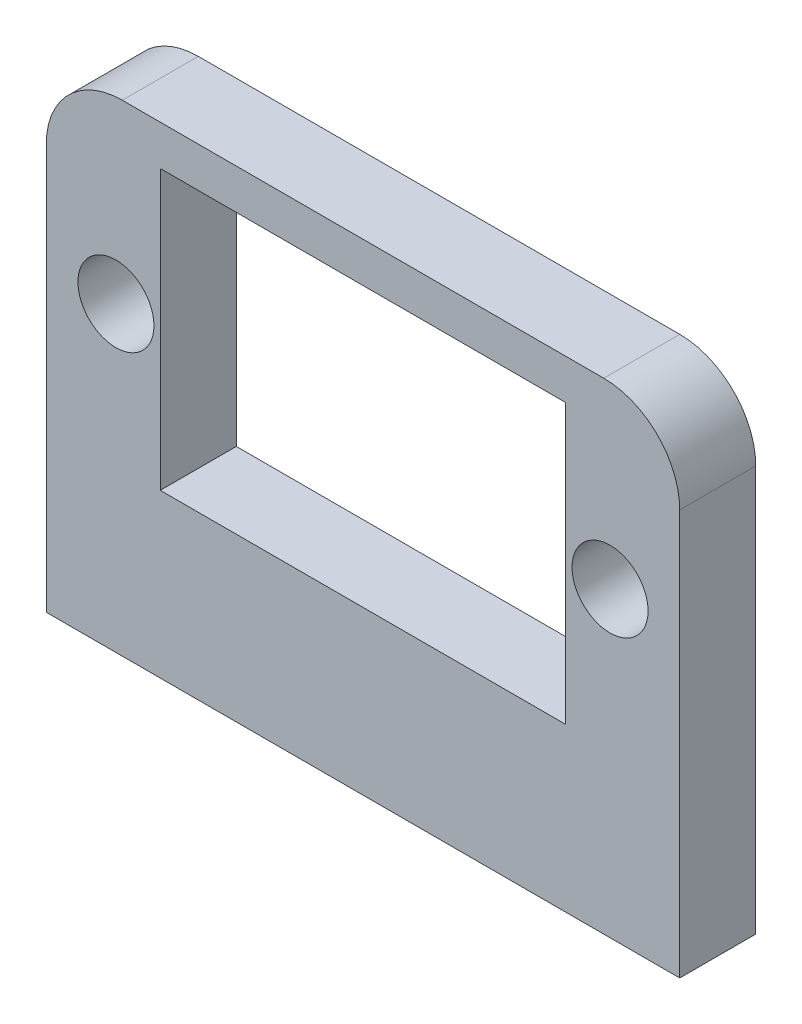
ISO-10303-21;
HEADER;
FILE_DESCRIPTION(('STEP AP214'),'2;1');
FILE_NAME('part.step','',(''),(''),'','','');
FILE_SCHEMA(('AUTOMOTIVE_DESIGN { 1 0 10303 214 1 1 1 1 }'));
ENDSEC;
DATA;
#1=APPLICATION_CONTEXT('core data for automotive mechanical design processes');
#2=APPLICATION_PROTOCOL_DEFINITION('international standard','automotive_design',2000,#1);
#3=PRODUCT_CONTEXT('',#1,'mechanical');
#4=PRODUCT('Part','Part','',(#3));
#5=PRODUCT_RELATED_PRODUCT_CATEGORY('part','',(#4));
#6=PRODUCT_DEFINITION_FORMATION('','',#4);
#7=PRODUCT_DEFINITION_CONTEXT('part definition',#1,'design');
#8=PRODUCT_DEFINITION('design','',#6,#7);
#9=PRODUCT_DEFINITION_SHAPE('','',#8);
#10=(LENGTH_UNIT() NAMED_UNIT(*) SI_UNIT(.MILLI.,.METRE.));
#11=(NAMED_UNIT(*) PLANE_ANGLE_UNIT() SI_UNIT($,.RADIAN.));
#12=(NAMED_UNIT(*) SI_UNIT($,.STERADIAN.) SOLID_ANGLE_UNIT());
#13=UNCERTAINTY_MEASURE_WITH_UNIT(LENGTH_MEASURE(1.E-05),#10,'distance_accuracy_value','');
#14=(GEOMETRIC_REPRESENTATION_CONTEXT(3) GLOBAL_UNCERTAINTY_ASSIGNED_CONTEXT((#13)) GLOBAL_UNIT_ASSIGNED_CONTEXT((#10,
#11,#12)) REPRESENTATION_CONTEXT('',''));
#15=CARTESIAN_POINT('',(0.,0.,0.));
#16=DIRECTION('',(0.,0.,1.));
#17=DIRECTION('',(1.,0.,0.));
#18=AXIS2_PLACEMENT_3D('',#15,#16,#17);
#19=CARTESIAN_POINT('',(-9.49999999999999,15.,0.));
#20=DIRECTION('',(0.,0.,-1.));
#21=DIRECTION('',(-1.,0.,0.));
#22=AXIS2_PLACEMENT_3D('',#19,#20,#21);
#23=CYLINDRICAL_SURFACE('',#22,3.);
#24=CARTESIAN_POINT('',(-9.5,15.,-13.1108616705018));
#25=DIRECTION('',(0.,0.,1.));
#26=DIRECTION('',(1.,0.,0.));
#27=AXIS2_PLACEMENT_3D('',#24,#25,#26);
#28=CIRCLE('',#27,3.);
#29=CARTESIAN_POINT('',(-12.5,15.,-13.1108616705018));
#30=VERTEX_POINT('',#29);
#31=CARTESIAN_POINT('',(-9.5,18.,-13.1108616705018));
#32=VERTEX_POINT('',#31);
#33=EDGE_CURVE('E197',#30,#32,#28,.F.);
#34=ORIENTED_EDGE('',*,*,#33,.F.);
#35=DIRECTION('',(0.,0.,1.));
#36=VECTOR('',#35,1.);
#37=CARTESIAN_POINT('',(-12.5,15.,-13.1108616705018));
#38=LINE('',#37,#36);
#39=CARTESIAN_POINT('',(-12.5,15.,-10.1108616705018));
#40=VERTEX_POINT('',#39);
#41=EDGE_CURVE('E195',#40,#30,#38,.F.);
#42=ORIENTED_EDGE('',*,*,#41,.F.);
#43=CARTESIAN_POINT('',(-9.5,15.,-10.1108616705018));
#44=DIRECTION('',(0.,0.,-1.));
#45=DIRECTION('',(-1.,0.,0.));
#46=AXIS2_PLACEMENT_3D('',#43,#44,#45);
#47=CIRCLE('',#46,3.);
#48=CARTESIAN_POINT('',(-9.5,18.,-10.1108616705018));
#49=VERTEX_POINT('',#48);
#50=EDGE_CURVE('E193',#49,#40,#47,.F.);
#51=ORIENTED_EDGE('',*,*,#50,.F.);
#52=DIRECTION('',(0.,0.,1.));
#53=VECTOR('',#52,1.);
#54=CARTESIAN_POINT('',(-9.5,18.,-10.1108616705018));
#55=LINE('',#54,#53);
#56=EDGE_CURVE('E123',#32,#49,#55,.T.);
#57=ORIENTED_EDGE('',*,*,#56,.F.);
#58=EDGE_LOOP('',(#34,#42,#51,#57));
#59=FACE_BOUND('',#58,.T.);
#60=ADVANCED_FACE('F38',(#59),#23,.T.);
#61=CARTESIAN_POINT('',(0.,18.,0.));
#62=DIRECTION('',(0.,1.,0.));
#63=DIRECTION('',(0.,0.,1.));
#64=AXIS2_PLACEMENT_3D('',#61,#62,#63);
#65=PLANE('',#64);
#66=DIRECTION('',(1.,0.,0.));
#67=VECTOR('',#66,1.);
#68=CARTESIAN_POINT('',(-12.5,18.,-10.1108616705018));
#69=LINE('',#68,#67);
#70=CARTESIAN_POINT('',(9.5,18.,-10.1108616705018));
#71=VERTEX_POINT('',#70);
#72=EDGE_CURVE('E185',#49,#71,#69,.T.);
#73=ORIENTED_EDGE('',*,*,#72,.T.);
#74=DIRECTION('',(0.,0.,-1.));
#75=VECTOR('',#74,1.);
#76=CARTESIAN_POINT('',(9.5,18.,-13.1108616705018));
#77=LINE('',#76,#75);
#78=CARTESIAN_POINT('',(9.5,18.,-13.1108616705018));
#79=VERTEX_POINT('',#78);
#80=EDGE_CURVE('E200',#71,#79,#77,.T.);
#81=ORIENTED_EDGE('',*,*,#80,.T.);
#82=DIRECTION('',(-1.,0.,0.));
#83=VECTOR('',#82,1.);
#84=CARTESIAN_POINT('',(-12.5,18.,-13.1108616705018));
#85=LINE('',#84,#83);
#86=EDGE_CURVE('E183',#79,#32,#85,.T.);
#87=ORIENTED_EDGE('',*,*,#86,.T.);
#88=ORIENTED_EDGE('',*,*,#56,.T.);
#89=EDGE_LOOP('',(#73,#81,#87,#88));
#90=FACE_BOUND('',#89,.T.);
#91=ADVANCED_FACE('F205',(#90),#65,.T.);
#92=CARTESIAN_POINT('',(9.50000000000002,15.,0.));
#93=DIRECTION('',(0.,0.,1.));
#94=DIRECTION('',(1.,0.,0.));
#95=AXIS2_PLACEMENT_3D('',#92,#93,#94);
#96=CYLINDRICAL_SURFACE('',#95,3.);
#97=CARTESIAN_POINT('',(9.5,15.,-10.1108616705018));
#98=DIRECTION('',(0.,0.,-1.));
#99=DIRECTION('',(-1.,0.,0.));
#100=AXIS2_PLACEMENT_3D('',#97,#98,#99);
#101=CIRCLE('',#100,3.);
#102=CARTESIAN_POINT('',(12.5,15.,-10.1108616705018));
#103=VERTEX_POINT('',#102);
#104=EDGE_CURVE('E11',#103,#71,#101,.F.);
#105=ORIENTED_EDGE('',*,*,#104,.F.);
#106=DIRECTION('',(0.,0.,-1.));
#107=VECTOR('',#106,1.);
#108=CARTESIAN_POINT('',(12.5,15.,-10.1108616705018));
#109=LINE('',#108,#107);
#110=CARTESIAN_POINT('',(12.5,15.,-13.1108616705018));
#111=VERTEX_POINT('',#110);
#112=EDGE_CURVE('E46',#111,#103,#109,.F.);
#113=ORIENTED_EDGE('',*,*,#112,.F.);
#114=CARTESIAN_POINT('',(9.5,15.,-13.1108616705018));
#115=DIRECTION('',(0.,0.,1.));
#116=DIRECTION('',(1.,0.,0.));
#117=AXIS2_PLACEMENT_3D('',#114,#115,#116);
#118=CIRCLE('',#117,3.);
#119=EDGE_CURVE('E122',#79,#111,#118,.F.);
#120=ORIENTED_EDGE('',*,*,#119,.F.);
#121=ORIENTED_EDGE('',*,*,#80,.F.);
#122=EDGE_LOOP('',(#105,#113,#120,#121));
#123=FACE_BOUND('',#122,.T.);
#124=ADVANCED_FACE('F40',(#123),#96,.T.);
#125=CARTESIAN_POINT('',(8.,16.4173869144464,-28.1108616705018));
#126=DIRECTION('',(1.,0.,0.));
#127=DIRECTION('',(0.,0.,-1.));
#128=AXIS2_PLACEMENT_3D('',#125,#126,#127);
#129=PLANE('',#128);
#130=DIRECTION('',(0.,0.,1.));
#131=VECTOR('',#130,1.);
#132=CARTESIAN_POINT('',(8.,5.41738691444643,-28.1108616705018));
#133=LINE('',#132,#131);
#134=CARTESIAN_POINT('',(8.,5.41738691444643,-13.1108616705018));
#135=VERTEX_POINT('',#134);
#136=CARTESIAN_POINT('',(8.,5.41738691444643,-10.1108616705018));
#137=VERTEX_POINT('',#136);
#138=EDGE_CURVE('E162',#135,#137,#133,.T.);
#139=ORIENTED_EDGE('',*,*,#138,.T.);
#140=DIRECTION('',(0.,1.,0.));
#141=VECTOR('',#140,1.);
#142=CARTESIAN_POINT('',(8.,16.4173869144464,-10.1108616705018));
#143=LINE('',#142,#141);
#144=CARTESIAN_POINT('',(8.,16.4173869144464,-10.1108616705018));
#145=VERTEX_POINT('',#144);
#146=EDGE_CURVE('E150',#137,#145,#143,.T.);
#147=ORIENTED_EDGE('',*,*,#146,.T.);
#148=DIRECTION('',(0.,0.,1.));
#149=VECTOR('',#148,1.);
#150=CARTESIAN_POINT('',(8.,16.4173869144464,-28.1108616705018));
#151=LINE('',#150,#149);
#152=CARTESIAN_POINT('',(8.,16.4173869144464,-13.1108616705018));
#153=VERTEX_POINT('',#152);
#154=EDGE_CURVE('E160',#153,#145,#151,.T.);
#155=ORIENTED_EDGE('',*,*,#154,.F.);
#156=DIRECTION('',(0.,1.,0.));
#157=VECTOR('',#156,1.);
#158=CARTESIAN_POINT('',(8.,18.,-13.1108616705018));
#159=LINE('',#158,#157);
#160=EDGE_CURVE('E168',#135,#153,#159,.T.);
#161=ORIENTED_EDGE('',*,*,#160,.F.);
#162=EDGE_LOOP('',(#139,#147,#155,#161));
#163=FACE_BOUND('',#162,.T.);
#164=ADVANCED_FACE('F215',(#163),#129,.F.);
#165=CARTESIAN_POINT('',(-8.,16.4173869144464,-28.1108616705018));
#166=DIRECTION('',(0.,1.,0.));
#167=DIRECTION('',(0.,0.,1.));
#168=AXIS2_PLACEMENT_3D('',#165,#166,#167);
#169=PLANE('',#168);
#170=ORIENTED_EDGE('',*,*,#154,.T.);
#171=DIRECTION('',(-1.,0.,0.));
#172=VECTOR('',#171,1.);
#173=CARTESIAN_POINT('',(-8.,16.4173869144464,-10.1108616705018));
#174=LINE('',#173,#172);
#175=CARTESIAN_POINT('',(-8.,16.4173869144464,-10.1108616705018));
#176=VERTEX_POINT('',#175);
#177=EDGE_CURVE('E153',#145,#176,#174,.T.);
#178=ORIENTED_EDGE('',*,*,#177,.T.);
#179=DIRECTION('',(0.,0.,1.));
#180=VECTOR('',#179,1.);
#181=CARTESIAN_POINT('',(-8.,16.4173869144464,-28.1108616705018));
#182=LINE('',#181,#180);
#183=CARTESIAN_POINT('',(-8.,16.4173869144464,-13.1108616705018));
#184=VERTEX_POINT('',#183);
#185=EDGE_CURVE('E157',#184,#176,#182,.T.);
#186=ORIENTED_EDGE('',*,*,#185,.F.);
#187=DIRECTION('',(-1.,0.,0.));
#188=VECTOR('',#187,1.);
#189=CARTESIAN_POINT('',(-12.5,16.4173869144464,-13.1108616705018));
#190=LINE('',#189,#188);
#191=EDGE_CURVE('E171',#153,#184,#190,.T.);
#192=ORIENTED_EDGE('',*,*,#191,.F.);
#193=EDGE_LOOP('',(#170,#178,#186,#192));
#194=FACE_BOUND('',#193,.T.);
#195=ADVANCED_FACE('F220',(#194),#169,.F.);
#196=CARTESIAN_POINT('',(-8.,16.4173869144464,-28.1108616705018));
#197=DIRECTION('',(-1.,0.,0.));
#198=DIRECTION('',(0.,0.,1.));
#199=AXIS2_PLACEMENT_3D('',#196,#197,#198);
#200=PLANE('',#199);
#201=ORIENTED_EDGE('',*,*,#185,.T.);
#202=DIRECTION('',(0.,-1.,0.));
#203=VECTOR('',#202,1.);
#204=CARTESIAN_POINT('',(-8.,16.4173869144464,-10.1108616705018));
#205=LINE('',#204,#203);
#206=CARTESIAN_POINT('',(-8.,5.41738691444643,-10.1108616705018));
#207=VERTEX_POINT('',#206);
#208=EDGE_CURVE('E144',#176,#207,#205,.T.);
#209=ORIENTED_EDGE('',*,*,#208,.T.);
#210=DIRECTION('',(0.,0.,1.));
#211=VECTOR('',#210,1.);
#212=CARTESIAN_POINT('',(-8.,5.41738691444643,-28.1108616705018));
#213=LINE('',#212,#211);
#214=CARTESIAN_POINT('',(-8.,5.41738691444643,-13.1108616705018));
#215=VERTEX_POINT('',#214);
#216=EDGE_CURVE('E156',#215,#207,#213,.T.);
#217=ORIENTED_EDGE('',*,*,#216,.F.);
#218=DIRECTION('',(0.,-1.,0.));
#219=VECTOR('',#218,1.);
#220=CARTESIAN_POINT('',(-8.,18.,-13.1108616705018));
#221=LINE('',#220,#219);
#222=EDGE_CURVE('E174',#184,#215,#221,.T.);
#223=ORIENTED_EDGE('',*,*,#222,.F.);
#224=EDGE_LOOP('',(#201,#209,#217,#223));
#225=FACE_BOUND('',#224,.T.);
#226=ADVANCED_FACE('F243',(#225),#200,.F.);
#227=CARTESIAN_POINT('',(-8.,5.41738691444643,-28.1108616705018));
#228=DIRECTION('',(0.,-1.,0.));
#229=DIRECTION('',(0.,0.,-1.));
#230=AXIS2_PLACEMENT_3D('',#227,#228,#229);
#231=PLANE('',#230);
#232=ORIENTED_EDGE('',*,*,#216,.T.);
#233=DIRECTION('',(1.,0.,0.));
#234=VECTOR('',#233,1.);
#235=CARTESIAN_POINT('',(-8.,5.41738691444643,-10.1108616705018));
#236=LINE('',#235,#234);
#237=EDGE_CURVE('E147',#207,#137,#236,.T.);
#238=ORIENTED_EDGE('',*,*,#237,.T.);
#239=ORIENTED_EDGE('',*,*,#138,.F.);
#240=DIRECTION('',(1.,0.,0.));
#241=VECTOR('',#240,1.);
#242=CARTESIAN_POINT('',(-12.5,5.41738691444643,-13.1108616705018));
#243=LINE('',#242,#241);
#244=EDGE_CURVE('E159',#215,#135,#243,.T.);
#245=ORIENTED_EDGE('',*,*,#244,.F.);
#246=EDGE_LOOP('',(#232,#238,#239,#245));
#247=FACE_BOUND('',#246,.T.);
#248=ADVANCED_FACE('F246',(#247),#231,.F.);
#249=CARTESIAN_POINT('',(-9.75,10.9173869144464,-28.1108616705018));
#250=DIRECTION('',(0.,0.,1.));
#251=DIRECTION('',(1.,0.,0.));
#252=AXIS2_PLACEMENT_3D('',#249,#250,#251);
#253=CYLINDRICAL_SURFACE('',#252,1.5);
#254=CARTESIAN_POINT('',(-9.75,10.9173869144464,-10.1108616705018));
#255=DIRECTION('',(0.,0.,1.));
#256=DIRECTION('',(1.,0.,0.));
#257=AXIS2_PLACEMENT_3D('',#254,#255,#256);
#258=CIRCLE('',#257,1.5);
#259=CARTESIAN_POINT('',(-8.25,10.9173869144464,-10.1108616705018));
#260=VERTEX_POINT('',#259);
#261=EDGE_CURVE('E139',#260,#260,#258,.T.);
#262=ORIENTED_EDGE('',*,*,#261,.T.);
#263=EDGE_LOOP('',(#262));
#264=FACE_BOUND('',#263,.T.);
#265=CARTESIAN_POINT('',(-9.75,10.9173869144464,-13.1108616705018));
#266=DIRECTION('',(0.,0.,1.));
#267=DIRECTION('',(1.,0.,0.));
#268=AXIS2_PLACEMENT_3D('',#265,#266,#267);
#269=CIRCLE('',#268,1.5);
#270=CARTESIAN_POINT('',(-8.25,10.9173869144464,-13.1108616705018));
#271=VERTEX_POINT('',#270);
#272=EDGE_CURVE('E177',#271,#271,#269,.T.);
#273=ORIENTED_EDGE('',*,*,#272,.F.);
#274=EDGE_LOOP('',(#273));
#275=FACE_BOUND('',#274,.T.);
#276=ADVANCED_FACE('F249',(#264,#275),#253,.F.);
#277=CARTESIAN_POINT('',(9.75,10.9173869144464,-28.1108616705018));
#278=DIRECTION('',(0.,0.,1.));
#279=DIRECTION('',(1.,0.,0.));
#280=AXIS2_PLACEMENT_3D('',#277,#278,#279);
#281=CYLINDRICAL_SURFACE('',#280,1.5);
#282=CARTESIAN_POINT('',(9.75,10.9173869144464,-10.1108616705018));
#283=DIRECTION('',(0.,0.,1.));
#284=DIRECTION('',(-1.,0.,0.));
#285=AXIS2_PLACEMENT_3D('',#282,#283,#284);
#286=CIRCLE('',#285,1.5);
#287=CARTESIAN_POINT('',(8.25,10.9173869144464,-10.1108616705018));
#288=VERTEX_POINT('',#287);
#289=EDGE_CURVE('E136',#288,#288,#286,.T.);
#290=ORIENTED_EDGE('',*,*,#289,.T.);
#291=EDGE_LOOP('',(#290));
#292=FACE_BOUND('',#291,.T.);
#293=CARTESIAN_POINT('',(9.75,10.9173869144464,-13.1108616705018));
#294=DIRECTION('',(0.,0.,1.));
#295=DIRECTION('',(1.,0.,0.));
#296=AXIS2_PLACEMENT_3D('',#293,#294,#295);
#297=CIRCLE('',#296,1.5);
#298=CARTESIAN_POINT('',(11.25,10.9173869144464,-13.1108616705018));
#299=VERTEX_POINT('',#298);
#300=EDGE_CURVE('E180',#299,#299,#297,.T.);
#301=ORIENTED_EDGE('',*,*,#300,.F.);
#302=EDGE_LOOP('',(#301));
#303=FACE_BOUND('',#302,.T.);
#304=ADVANCED_FACE('F240',(#292,#303),#281,.F.);
#305=CARTESIAN_POINT('',(-12.5,18.,-10.1108616705018));
#306=DIRECTION('',(0.,0.,-1.));
#307=DIRECTION('',(-1.,0.,0.));
#308=AXIS2_PLACEMENT_3D('',#305,#306,#307);
#309=PLANE('',#308);
#310=ORIENTED_EDGE('',*,*,#289,.F.);
#311=EDGE_LOOP('',(#310));
#312=FACE_BOUND('',#311,.T.);
#313=ORIENTED_EDGE('',*,*,#261,.F.);
#314=EDGE_LOOP('',(#313));
#315=FACE_BOUND('',#314,.T.);
#316=ORIENTED_EDGE('',*,*,#237,.F.);
#317=ORIENTED_EDGE('',*,*,#208,.F.);
#318=ORIENTED_EDGE('',*,*,#177,.F.);
#319=ORIENTED_EDGE('',*,*,#146,.F.);
#320=EDGE_LOOP('',(#316,#317,#318,#319));
#321=FACE_BOUND('',#320,.T.);
#322=DIRECTION('',(0.,-1.,0.));
#323=VECTOR('',#322,1.);
#324=CARTESIAN_POINT('',(12.5,18.,-10.1108616705018));
#325=LINE('',#324,#323);
#326=CARTESIAN_POINT('',(12.5,-1.,-10.1108616705018));
#327=VERTEX_POINT('',#326);
#328=EDGE_CURVE('E129',#103,#327,#325,.T.);
#329=ORIENTED_EDGE('',*,*,#328,.F.);
#330=ORIENTED_EDGE('',*,*,#104,.T.);
#331=ORIENTED_EDGE('',*,*,#72,.F.);
#332=ORIENTED_EDGE('',*,*,#50,.T.);
#333=DIRECTION('',(0.,-1.,0.));
#334=VECTOR('',#333,1.);
#335=CARTESIAN_POINT('',(-12.5,18.,-10.1108616705018));
#336=LINE('',#335,#334);
#337=CARTESIAN_POINT('',(-12.5,-1.,-10.1108616705018));
#338=VERTEX_POINT('',#337);
#339=EDGE_CURVE('E53',#40,#338,#336,.T.);
#340=ORIENTED_EDGE('',*,*,#339,.T.);
#341=DIRECTION('',(1.,0.,0.));
#342=VECTOR('',#341,1.);
#343=CARTESIAN_POINT('',(-12.5,-1.,-10.1108616705018));
#344=LINE('',#343,#342);
#345=EDGE_CURVE('E132',#338,#327,#344,.T.);
#346=ORIENTED_EDGE('',*,*,#345,.T.);
#347=EDGE_LOOP('',(#329,#330,#331,#332,#340,#346));
#348=FACE_BOUND('',#347,.T.);
#349=ADVANCED_FACE('F213',(#312,#315,#321,#348),#309,.F.);
#350=CARTESIAN_POINT('',(-12.5,18.,-13.1108616705018));
#351=DIRECTION('',(1.,0.,0.));
#352=DIRECTION('',(0.,0.,-1.));
#353=AXIS2_PLACEMENT_3D('',#350,#351,#352);
#354=PLANE('',#353);
#355=ORIENTED_EDGE('',*,*,#339,.F.);
#356=ORIENTED_EDGE('',*,*,#41,.T.);
#357=DIRECTION('',(0.,-1.,0.));
#358=VECTOR('',#357,1.);
#359=CARTESIAN_POINT('',(-12.5,18.,-13.1108616705018));
#360=LINE('',#359,#358);
#361=CARTESIAN_POINT('',(-12.5,-1.,-13.1108616705018));
#362=VERTEX_POINT('',#361);
#363=EDGE_CURVE('E124',#30,#362,#360,.T.);
#364=ORIENTED_EDGE('',*,*,#363,.T.);
#365=DIRECTION('',(0.,0.,1.));
#366=VECTOR('',#365,1.);
#367=CARTESIAN_POINT('',(-12.5,-1.,-13.1108616705018));
#368=LINE('',#367,#366);
#369=EDGE_CURVE('E135',#362,#338,#368,.T.);
#370=ORIENTED_EDGE('',*,*,#369,.T.);
#371=EDGE_LOOP('',(#355,#356,#364,#370));
#372=FACE_BOUND('',#371,.T.);
#373=ADVANCED_FACE('F234',(#372),#354,.F.);
#374=CARTESIAN_POINT('',(-12.5,18.,-13.1108616705018));
#375=DIRECTION('',(0.,0.,1.));
#376=DIRECTION('',(1.,0.,0.));
#377=AXIS2_PLACEMENT_3D('',#374,#375,#376);
#378=PLANE('',#377);
#379=ORIENTED_EDGE('',*,*,#300,.T.);
#380=EDGE_LOOP('',(#379));
#381=FACE_BOUND('',#380,.T.);
#382=ORIENTED_EDGE('',*,*,#272,.T.);
#383=EDGE_LOOP('',(#382));
#384=FACE_BOUND('',#383,.T.);
#385=ORIENTED_EDGE('',*,*,#191,.T.);
#386=ORIENTED_EDGE('',*,*,#222,.T.);
#387=ORIENTED_EDGE('',*,*,#244,.T.);
#388=ORIENTED_EDGE('',*,*,#160,.T.);
#389=EDGE_LOOP('',(#385,#386,#387,#388));
#390=FACE_BOUND('',#389,.T.);
#391=ORIENTED_EDGE('',*,*,#86,.F.);
#392=ORIENTED_EDGE('',*,*,#119,.T.);
#393=DIRECTION('',(0.,-1.,0.));
#394=VECTOR('',#393,1.);
#395=CARTESIAN_POINT('',(12.5,18.,-13.1108616705018));
#396=LINE('',#395,#394);
#397=CARTESIAN_POINT('',(12.5,-1.,-13.1108616705018));
#398=VERTEX_POINT('',#397);
#399=EDGE_CURVE('E114',#111,#398,#396,.T.);
#400=ORIENTED_EDGE('',*,*,#399,.T.);
#401=DIRECTION('',(-1.,0.,0.));
#402=VECTOR('',#401,1.);
#403=CARTESIAN_POINT('',(-12.5,-1.,-13.1108616705018));
#404=LINE('',#403,#402);
#405=EDGE_CURVE('E120',#398,#362,#404,.T.);
#406=ORIENTED_EDGE('',*,*,#405,.T.);
#407=ORIENTED_EDGE('',*,*,#363,.F.);
#408=ORIENTED_EDGE('',*,*,#33,.T.);
#409=EDGE_LOOP('',(#391,#392,#400,#406,#407,#408));
#410=FACE_BOUND('',#409,.T.);
#411=ADVANCED_FACE('F117',(#381,#384,#390,#410),#378,.F.);
#412=CARTESIAN_POINT('',(12.5,18.,-13.1108616705018));
#413=DIRECTION('',(-1.,0.,0.));
#414=DIRECTION('',(0.,0.,1.));
#415=AXIS2_PLACEMENT_3D('',#412,#413,#414);
#416=PLANE('',#415);
#417=ORIENTED_EDGE('',*,*,#399,.F.);
#418=ORIENTED_EDGE('',*,*,#112,.T.);
#419=ORIENTED_EDGE('',*,*,#328,.T.);
#420=DIRECTION('',(0.,0.,-1.));
#421=VECTOR('',#420,1.);
#422=CARTESIAN_POINT('',(12.5,-1.,-13.1108616705018));
#423=LINE('',#422,#421);
#424=EDGE_CURVE('E127',#327,#398,#423,.T.);
#425=ORIENTED_EDGE('',*,*,#424,.T.);
#426=EDGE_LOOP('',(#417,#418,#419,#425));
#427=FACE_BOUND('',#426,.T.);
#428=ADVANCED_FACE('F128',(#427),#416,.F.);
#429=CARTESIAN_POINT('',(0.,-1.,-0.242383843855438));
#430=DIRECTION('',(0.,1.,0.));
#431=DIRECTION('',(0.,0.,1.));
#432=AXIS2_PLACEMENT_3D('',#429,#430,#431);
#433=PLANE('',#432);
#434=ORIENTED_EDGE('',*,*,#369,.F.);
#435=ORIENTED_EDGE('',*,*,#405,.F.);
#436=ORIENTED_EDGE('',*,*,#424,.F.);
#437=ORIENTED_EDGE('',*,*,#345,.F.);
#438=EDGE_LOOP('',(#434,#435,#436,#437));
#439=FACE_BOUND('',#438,.T.);
#440=ADVANCED_FACE('F134',(#439),#433,.F.);
#441=CLOSED_SHELL('',(#60,#91,#124,#164,#195,#226,#248,#276,#304,#349,#373,#411,#428,#440));
#442=MANIFOLD_SOLID_BREP('B2',#441);
#443=ADVANCED_BREP_SHAPE_REPRESENTATION('',(#18,#442),#14);
#444=SHAPE_DEFINITION_REPRESENTATION(#9,#443);
ENDSEC;
END-ISO-10303-21;
